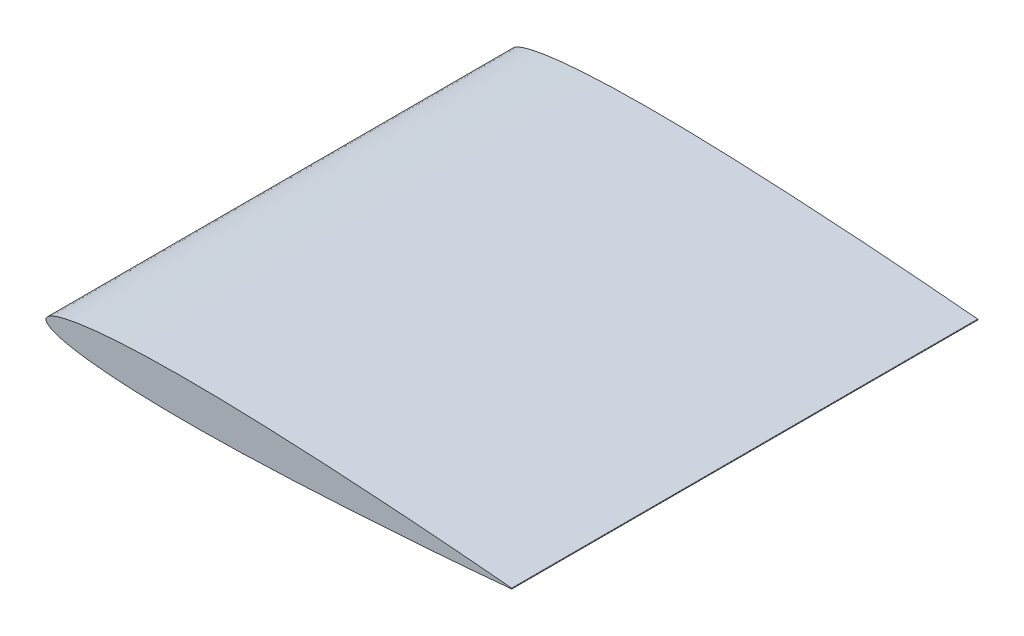
ISO-10303-21;
HEADER;
FILE_DESCRIPTION(('STEP AP214'),'2;1');
FILE_NAME('part.step','',(''),(''),'','','');
FILE_SCHEMA(('AUTOMOTIVE_DESIGN { 1 0 10303 214 1 1 1 1 }'));
ENDSEC;
DATA;
#1=APPLICATION_CONTEXT('core data for automotive mechanical design processes');
#2=APPLICATION_PROTOCOL_DEFINITION('international standard','automotive_design',2000,#1);
#3=PRODUCT_CONTEXT('',#1,'mechanical');
#4=PRODUCT('Part','Part','',(#3));
#5=PRODUCT_RELATED_PRODUCT_CATEGORY('part','',(#4));
#6=PRODUCT_DEFINITION_FORMATION('','',#4);
#7=PRODUCT_DEFINITION_CONTEXT('part definition',#1,'design');
#8=PRODUCT_DEFINITION('design','',#6,#7);
#9=PRODUCT_DEFINITION_SHAPE('','',#8);
#10=(LENGTH_UNIT() NAMED_UNIT(*) SI_UNIT(.MILLI.,.METRE.));
#11=(NAMED_UNIT(*) PLANE_ANGLE_UNIT() SI_UNIT($,.RADIAN.));
#12=(NAMED_UNIT(*) SI_UNIT($,.STERADIAN.) SOLID_ANGLE_UNIT());
#13=UNCERTAINTY_MEASURE_WITH_UNIT(LENGTH_MEASURE(1.E-05),#10,'distance_accuracy_value','');
#14=(GEOMETRIC_REPRESENTATION_CONTEXT(3) GLOBAL_UNCERTAINTY_ASSIGNED_CONTEXT((#13)) GLOBAL_UNIT_ASSIGNED_CONTEXT((#10,
#11,#12)) REPRESENTATION_CONTEXT('',''));
#15=CARTESIAN_POINT('',(0.,0.,0.));
#16=DIRECTION('',(0.,0.,1.));
#17=DIRECTION('',(1.,0.,0.));
#18=AXIS2_PLACEMENT_3D('',#15,#16,#17);
#19=CARTESIAN_POINT('',(142.729373899223,0.159972039207736,-190.5));
#20=CARTESIAN_POINT('',(142.479186781948,0.183389240949801,-190.5));
#21=CARTESIAN_POINT('',(142.088604252542,0.220145092693944,-190.5));
#22=CARTESIAN_POINT('',(141.526697730812,0.272742751406665,-190.5));
#23=CARTESIAN_POINT('',(141.012814783548,0.320538816976024,-190.5));
#24=CARTESIAN_POINT('',(140.406748418489,0.376789486376101,-190.5));
#25=CARTESIAN_POINT('',(139.708986664848,0.441220047436592,-190.5));
#26=CARTESIAN_POINT('',(138.920333107288,0.51403566806961,-190.5));
#27=CARTESIAN_POINT('',(138.041417356676,0.59430420814471,-190.5));
#28=CARTESIAN_POINT('',(137.073229569794,0.682249039644804,-190.5));
#29=CARTESIAN_POINT('',(136.016765435286,0.778107959823981,-190.5));
#30=CARTESIAN_POINT('',(134.872993078166,0.880464916645677,-190.5));
#31=CARTESIAN_POINT('',(133.643037517829,0.990222815984241,-190.5));
#32=CARTESIAN_POINT('',(132.328108140328,1.10652887809074,-190.5));
#33=CARTESIAN_POINT('',(130.929495464496,1.22924505829896,-190.5));
#34=CARTESIAN_POINT('',(129.448626559515,1.35774600885281,-190.5));
#35=CARTESIAN_POINT('',(127.886955115269,1.49238130431334,-190.5));
#36=CARTESIAN_POINT('',(126.245957209597,1.63229773767781,-190.5));
#37=CARTESIAN_POINT('',(124.527338311727,1.777077732539,-190.5));
#38=CARTESIAN_POINT('',(122.732803785357,1.92706831396486,-190.5));
#39=CARTESIAN_POINT('',(120.864080122935,2.08135886131517,-190.5));
#40=CARTESIAN_POINT('',(118.922876779055,2.23957548704205,-190.5));
#41=CARTESIAN_POINT('',(116.911283181738,2.40206902055985,-190.5));
#42=CARTESIAN_POINT('',(114.831256695494,2.56761967202432,-190.5));
#43=CARTESIAN_POINT('',(112.684865067471,2.73630458443066,-190.5));
#44=CARTESIAN_POINT('',(110.474213261044,2.90795710696232,-190.5));
#45=CARTESIAN_POINT('',(108.201422873191,3.08179772831832,-190.5));
#46=CARTESIAN_POINT('',(105.868808461494,3.25783808934433,-190.5));
#47=CARTESIAN_POINT('',(103.478652206742,3.43568118888438,-190.5));
#48=CARTESIAN_POINT('',(101.03320096793,3.61449735595793,-190.5));
#49=CARTESIAN_POINT('',(98.5350487790652,3.79467067884001,-190.5));
#50=CARTESIAN_POINT('',(95.9865707596696,3.97539591531313,-190.5));
#51=CARTESIAN_POINT('',(93.390301344807,4.15622894625216,-190.5));
#52=CARTESIAN_POINT('',(90.7488183868106,4.33730963289552,-190.5));
#53=CARTESIAN_POINT('',(88.0646603918126,4.51739744301513,-190.5));
#54=CARTESIAN_POINT('',(85.3405433275165,4.69685772906639,-190.5));
#55=CARTESIAN_POINT('',(82.5791313789845,4.87532487952883,-190.5));
#56=CARTESIAN_POINT('',(79.7831039473282,5.05164489269945,-190.5));
#57=CARTESIAN_POINT('',(76.9553746181777,5.22629329256366,-190.5));
#58=CARTESIAN_POINT('',(74.0985726217929,5.39838804570514,-190.5));
#59=CARTESIAN_POINT('',(71.2156347958231,5.56772229979622,-190.5));
#60=CARTESIAN_POINT('',(67.327609501056,5.78951399249321,-190.5));
#61=CARTESIAN_POINT('',(63.4141127462938,6.00344160630866,-190.5));
#62=CARTESIAN_POINT('',(59.4788095479756,6.20716181235994,-190.5));
#63=CARTESIAN_POINT('',(56.5079267497801,6.35594717328671,-190.5));
#64=CARTESIAN_POINT('',(53.5281299816943,6.49874071209984,-190.5));
#65=CARTESIAN_POINT('',(50.5425001002317,6.63572882319038,-190.5));
#66=CARTESIAN_POINT('',(47.5539579826413,6.76656668096271,-190.5));
#67=CARTESIAN_POINT('',(44.5653954103751,6.8901812602542,-190.5));
#68=CARTESIAN_POINT('',(41.5797529213656,7.00662209650516,-190.5));
#69=CARTESIAN_POINT('',(38.5999524872136,7.11559771700663,-190.5));
#70=CARTESIAN_POINT('',(35.629015167185,7.21596220002168,-190.5));
#71=CARTESIAN_POINT('',(32.6698225020347,7.30798873354714,-190.5));
#72=CARTESIAN_POINT('',(29.7253345911511,7.39064405803896,-190.5));
#73=CARTESIAN_POINT('',(26.7984290956475,7.4642709780063,-190.5));
#74=CARTESIAN_POINT('',(23.89199813339,7.52744887224202,-190.5));
#75=CARTESIAN_POINT('',(21.0089867489146,7.58092916447286,-190.5));
#76=CARTESIAN_POINT('',(18.1520983205952,7.62309952248371,-190.5));
#77=CARTESIAN_POINT('',(15.3242747238992,7.65512365878461,-190.5));
#78=CARTESIAN_POINT('',(12.5281604710234,7.67505609045825,-190.5));
#79=CARTESIAN_POINT('',(8.87161059142888,7.68668397747053,-190.5));
#80=CARTESIAN_POINT('',(5.26645716396965,7.67500178124356,-190.5));
#81=CARTESIAN_POINT('',(1.71647728043693,7.63773437312726,-190.5));
#82=CARTESIAN_POINT('',(-0.879931687152119,7.5977224832543,-190.5));
#83=CARTESIAN_POINT('',(-3.42856687517991,7.54500625909924,-190.5));
#84=CARTESIAN_POINT('',(-5.92690515442437,7.47994901789238,-190.5));
#85=CARTESIAN_POINT('',(-8.37250727798143,7.40159613562972,-190.5));
#86=CARTESIAN_POINT('',(-10.7628758947234,7.31103769545079,-190.5));
#87=CARTESIAN_POINT('',(-13.0956818614298,7.20719080406453,-190.5));
#88=CARTESIAN_POINT('',(-15.3686793703177,7.09098458850275,-190.5));
#89=CARTESIAN_POINT('',(-17.5795616174868,6.96209558882579,-190.5));
#90=CARTESIAN_POINT('',(-19.7261912714641,6.82091543903912,-190.5));
#91=CARTESIAN_POINT('',(-22.4547036092264,6.61933549797191,-190.5));
#92=CARTESIAN_POINT('',(-25.0900728135269,6.39190161429265,-190.5));
#93=CARTESIAN_POINT('',(-27.6288333077701,6.13525548050567,-190.5));
#94=CARTESIAN_POINT('',(-29.4236580361487,5.93456421434373,-190.5));
#95=CARTESIAN_POINT('',(-31.142649200105,5.72367170245318,-190.5));
#96=CARTESIAN_POINT('',(-32.7839781979879,5.50153427356191,-190.5));
#97=CARTESIAN_POINT('',(-34.3460867609795,5.26957130651408,-190.5));
#98=CARTESIAN_POINT('',(-35.8273766898622,5.02761266766267,-190.5));
#99=CARTESIAN_POINT('',(-37.2264867327781,4.77617947567997,-190.5));
#100=CARTESIAN_POINT('',(-38.5419896364056,4.51573291467262,-190.5));
#101=CARTESIAN_POINT('',(-39.7725614246254,4.24639761172972,-190.5));
#102=CARTESIAN_POINT('',(-40.9170432185424,3.96904878024634,-190.5));
#103=CARTESIAN_POINT('',(-41.9744916712147,3.68406692694299,-190.5));
#104=CARTESIAN_POINT('',(-42.9436793406703,3.39117297901638,-190.5));
#105=CARTESIAN_POINT('',(-43.8238992675171,3.09142558251948,-190.5));
#106=CARTESIAN_POINT('',(-44.6143942574069,2.78529998806159,-190.5));
#107=CARTESIAN_POINT('',(-45.3142323423283,2.47223321008862,-190.5));
#108=CARTESIAN_POINT('',(-45.9233880389311,2.15353035855159,-190.5));
#109=CARTESIAN_POINT('',(-46.4412037339516,1.82845244847433,-190.5));
#110=CARTESIAN_POINT('',(-46.8677473550329,1.49734725273331,-190.5));
#111=CARTESIAN_POINT('',(-47.2031190951666,1.15947564984085,-190.5));
#112=CARTESIAN_POINT('',(-47.4460182134727,0.813039564460823,-190.5));
#113=CARTESIAN_POINT('',(-47.5947412136322,0.456996953228334,-190.5));
#114=CARTESIAN_POINT('',(-47.6445302270355,0.09371251662579,-190.5));
#115=CARTESIAN_POINT('',(-47.5950986214587,-0.269620724495049,-190.5));
#116=CARTESIAN_POINT('',(-47.4467259527999,-0.625809470786623,-190.5));
#117=CARTESIAN_POINT('',(-47.2041677610749,-0.972484342322491,-190.5));
#118=CARTESIAN_POINT('',(-46.8691285668963,-1.31068570613632,-190.5));
#119=CARTESIAN_POINT('',(-46.4429108793843,-1.64221035708078,-190.5));
#120=CARTESIAN_POINT('',(-45.9254152327122,-1.96779751485143,-190.5));
#121=CARTESIAN_POINT('',(-45.3165733571456,-2.28709947356454,-190.5));
#122=CARTESIAN_POINT('',(-44.6170435926118,-2.6008545709066,-190.5));
#123=CARTESIAN_POINT('',(-43.8268501385373,-2.90775767248889,-190.5));
#124=CARTESIAN_POINT('',(-42.9469255163235,-3.2083708467626,-190.5));
#125=CARTESIAN_POINT('',(-41.9780264524212,-3.50221809845285,-190.5));
#126=CARTESIAN_POINT('',(-40.9208588644293,-3.78824008654256,-190.5));
#127=CARTESIAN_POINT('',(-39.776650468266,-4.06671467619483,-190.5));
#128=CARTESIAN_POINT('',(-38.5463442360903,-4.33726043284882,-190.5));
#129=CARTESIAN_POINT('',(-37.231098185239,-4.59900100347733,-190.5));
#130=CARTESIAN_POINT('',(-35.8322361685879,-4.85181045858032,-190.5));
#131=CARTESIAN_POINT('',(-34.3511849850747,-5.09522621020338,-190.5));
#132=CARTESIAN_POINT('',(-32.7893053732441,-5.32872580078488,-190.5));
#133=CARTESIAN_POINT('',(-31.1481956989111,-5.55247779164925,-190.5));
#134=CARTESIAN_POINT('',(-29.4294128338146,-5.76506127168081,-190.5));
#135=CARTESIAN_POINT('',(-27.6347864054406,-5.96751811274626,-190.5));
#136=CARTESIAN_POINT('',(-25.0962796171966,-6.22666164663733,-190.5));
#137=CARTESIAN_POINT('',(-22.4611354278776,-6.45668798408461,-190.5));
#138=CARTESIAN_POINT('',(-19.7328227161619,-6.66095202167232,-190.5));
#139=CARTESIAN_POINT('',(-17.5863329879257,-6.80424386584013,-190.5));
#140=CARTESIAN_POINT('',(-15.3755786060796,-6.93530777480651,-190.5));
#141=CARTESIAN_POINT('',(-13.1026965157896,-7.05375001213992,-190.5));
#142=CARTESIAN_POINT('',(-10.7699938380457,-7.15989176828827,-190.5));
#143=CARTESIAN_POINT('',(-8.37971546550868,-7.25280170733938,-190.5));
#144=CARTESIAN_POINT('',(-5.93419160557629,-7.33356043074859,-190.5));
#145=CARTESIAN_POINT('',(-3.43591853579026,-7.40107539911632,-190.5));
#146=CARTESIAN_POINT('',(-0.887336440992833,-7.45629883635755,-190.5));
#147=CARTESIAN_POINT('',(1.70903190823079,-7.4988649432709,-190.5));
#148=CARTESIAN_POINT('',(5.25897341187932,-7.53962465215151,-190.5));
#149=CARTESIAN_POINT('',(8.86411360239678,-7.55485343890251,-190.5));
#150=CARTESIAN_POINT('',(12.5206731516449,-7.54682271533122,-190.5));
#151=CARTESIAN_POINT('',(15.3168056601869,-7.52964099124633,-190.5));
#152=CARTESIAN_POINT('',(18.1446593925085,-7.50039876268522,-190.5));
#153=CARTESIAN_POINT('',(21.0015879238095,-7.46103891006551,-190.5));
#154=CARTESIAN_POINT('',(23.8846505248568,-7.41039482734864,-190.5));
#155=CARTESIAN_POINT('',(26.791142232441,-7.3500761865012,-190.5));
#156=CARTESIAN_POINT('',(29.7181187426697,-7.27932866695085,-190.5));
#157=CARTESIAN_POINT('',(32.6626865415297,-7.19957004407513,-190.5));
#158=CARTESIAN_POINT('',(35.6219683065367,-7.11045468261043,-190.5));
#159=CARTESIAN_POINT('',(38.593002923258,-7.01301292958135,-190.5));
#160=CARTESIAN_POINT('',(41.5729091210837,-6.90696876238633,-190.5));
#161=CARTESIAN_POINT('',(44.5586647149009,-6.79346513021857,-190.5));
#162=CARTESIAN_POINT('',(47.5473474477841,-6.67279063113492,-190.5));
#163=CARTESIAN_POINT('',(50.5360168319547,-6.54489283694325,-190.5));
#164=CARTESIAN_POINT('',(53.5217800317638,-6.41084192747576,-190.5));
#165=CARTESIAN_POINT('',(56.5017158321506,-6.27097985472669,-190.5));
#166=CARTESIAN_POINT('',(59.4727435614599,-6.12511719357998,-190.5));
#167=CARTESIAN_POINT('',(63.4082452667762,-5.92526846954686,-190.5));
#168=CARTESIAN_POINT('',(67.3219505807011,-5.71519089043973,-190.5));
#169=CARTESIAN_POINT('',(71.2101921833016,-5.49722417852046,-190.5));
#170=CARTESIAN_POINT('',(74.0932951980653,-5.33072611764013,-190.5));
#171=CARTESIAN_POINT('',(76.9502651115519,-5.16144184773078,-190.5));
#172=CARTESIAN_POINT('',(79.7781648840411,-4.98957533188432,-190.5));
#173=CARTESIAN_POINT('',(82.574364418838,-4.81600601656573,-190.5));
#174=CARTESIAN_POINT('',(85.3359505995228,-4.64025551175838,-190.5));
#175=CARTESIAN_POINT('',(88.0602428910229,-4.46347518272635,-190.5));
#176=CARTESIAN_POINT('',(90.7445767498917,-4.28602801990158,-190.5));
#177=CARTESIAN_POINT('',(93.3862365691589,-4.10754599915223,-190.5));
#178=CARTESIAN_POINT('',(95.9826826235374,-3.92926715483207,-190.5));
#179=CARTESIAN_POINT('',(98.5313371995309,-3.75104908978917,-190.5));
#180=CARTESIAN_POINT('',(101.029665426397,-3.57333342966464,-190.5));
#181=CARTESIAN_POINT('',(103.475291393599,-3.39692307974503,-190.5));
#182=CARTESIAN_POINT('',(105.865621446236,-3.22143140004116,-190.5));
#183=CARTESIAN_POINT('',(108.198407910205,-3.04768585076806,-190.5));
#184=CARTESIAN_POINT('',(110.471368215268,-2.87608118777745,-190.5));
#185=CARTESIAN_POINT('',(112.682187816413,-2.70660349326627,-190.5));
#186=CARTESIAN_POINT('',(114.828744350842,-2.54003019102171,-190.5));
#187=CARTESIAN_POINT('',(116.908932692255,-2.37652586100645,-190.5));
#188=CARTESIAN_POINT('',(118.92068517039,-2.21601132610121,-190.5));
#189=CARTESIAN_POINT('',(120.86204322171,-2.05970444998824,-190.5));
#190=CARTESIAN_POINT('',(122.730917764336,-1.90725234793281,-190.5));
#191=CARTESIAN_POINT('',(124.525598976688,-1.75902722561333,-190.5));
#192=CARTESIAN_POINT('',(126.24435947132,-1.61593800477977,-190.5));
#193=CARTESIAN_POINT('',(127.88549422675,-1.47763598286804,-190.5));
#194=CARTESIAN_POINT('',(129.447297363781,-1.34453705831539,-190.5));
#195=CARTESIAN_POINT('',(130.92829196594,-1.21749298560932,-190.5));
#196=CARTESIAN_POINT('',(132.327024687941,-1.09615276027977,-190.5));
#197=CARTESIAN_POINT('',(133.642067846106,-0.98114032589048,-190.5));
#198=CARTESIAN_POINT('',(134.87213078642,-0.872592457483473,-190.5));
#199=CARTESIAN_POINT('',(136.01600328449,-0.771360744652599,-190.5));
#200=CARTESIAN_POINT('',(137.072561209703,-0.676541175214349,-190.5));
#201=CARTESIAN_POINT('',(138.040835044463,-0.589548848119938,-190.5));
#202=CARTESIAN_POINT('',(138.919829334544,-0.51014498671436,-190.5));
#203=CARTESIAN_POINT('',(139.708554143384,-0.438105245048746,-190.5));
#204=CARTESIAN_POINT('',(140.406378943424,-0.374361143418198,-190.5));
#205=CARTESIAN_POINT('',(141.012500352223,-0.318706723477558,-190.5));
#206=CARTESIAN_POINT('',(141.714019077583,-0.254154753570296,-190.5));
#207=CARTESIAN_POINT('',(142.275954492989,-0.201866144981758,-190.5));
#208=CARTESIAN_POINT('',(142.666585451411,-0.16562875003313,-190.5));
#209=CARTESIAN_POINT('',(142.729216596021,-0.159828701050094,-190.5));
#210=B_SPLINE_CURVE_WITH_KNOTS('',3,(#19,#20,#21,#22,#23,#24,#25,#26,#27,#28,#29,#30,#31,#32,
#33,#34,#35,#36,#37,#38,#39,#40,#41,#42,#43,#44,#45,#46,#47,#48,#49,#50,#51,#52,#53,#54,#55,#56,
#57,#58,#59,#60,#61,#62,#63,#64,#65,#66,#67,#68,#69,#70,#71,#72,#73,#74,#75,#76,#77,#78,#79,#80,
#81,#82,#83,#84,#85,#86,#87,#88,#89,#90,#91,#92,#93,#94,#95,#96,#97,#98,#99,#100,#101,#102,#103,
#104,#105,#106,#107,#108,#109,#110,#111,#112,#113,#114,#115,#116,#117,#118,#119,#120,#121,#122,
#123,#124,#125,#126,#127,#128,#129,#130,#131,#132,#133,#134,#135,#136,#137,#138,#139,#140,#141,
#142,#143,#144,#145,#146,#147,#148,#149,#150,#151,#152,#153,#154,#155,#156,#157,#158,#159,#160,
#161,#162,#163,#164,#165,#166,#167,#168,#169,#170,#171,#172,#173,#174,#175,#176,#177,#178,#179,
#180,#181,#182,#183,#184,#185,#186,#187,#188,#189,#190,#191,#192,#193,#194,#195,#196,#197,#198,
#199,#200,#201,#202,#203,#204,#205,#206,#207,#208,#209),.UNSPECIFIED.,.F.,.F.,(4,1,1,1,1,1,1,1,
1,1,1,1,1,1,1,1,1,1,1,1,1,1,1,1,1,1,1,1,1,1,1,1,1,1,1,1,1,1,1,1,1,1,1,1,1,1,1,1,1,1,1,1,1,1,1,1,
1,1,1,1,1,1,1,1,1,1,1,1,1,1,1,1,1,1,1,1,1,1,1,1,1,1,1,1,1,1,1,1,1,1,1,1,1,1,1,1,1,1,1,1,1,1,1,1,
1,1,1,1,1,1,1,1,1,1,1,1,1,1,1,1,1,1,1,1,1,1,1,1,1,1,1,1,1,1,1,1,1,1,1,1,1,1,1,1,1,1,1,1,1,1,1,1,
1,1,1,1,1,1,1,1,1,1,1,1,1,1,1,1,1,1,1,1,1,1,1,1,1,1,1,1,1,1,1,1,1,1,1,1,4),(0.,
0.00196048808038713,0.00306078288954723,0.00440315115940912,0.00598710015129242,
0.00780962678363534,0.00987023823900945,0.0121663346757214,0.0146954518877861,
0.0174551251234933,0.02044271277755,0.0236548086080142,0.0270893538626305,0.0307418252005211,
0.0346086867033355,0.0386864881218547,0.0429711593175618,0.0474581806910442,0.0521426222949407,
0.0570209113106773,0.0620875440252226,0.0673380838166943,0.0727664556702497,0.0783671978029203,
0.0841358352788509,0.0900658434760326,0.0961512680582257,0.102386611537683,0.108765354390163,
0.115281579792531,0.121927783097088,0.128698472150078,0.135586708286801,0.142584959552117,
0.149687310329046,0.156886297525978,0.164174397596375,0.171545202082814,0.178990235007278,
0.186503524082293,0.19407660018027,0.209373856557355,0.217082104500233,0.224820878258927,
0.232581678728304,0.240357097895689,0.248139212500892,0.255920557432258,0.263693736348385,
0.271450841908107,0.279184433986156,0.286886142530036,0.294549552175486,0.302166304681413,
0.309729003720638,0.317230802900191,0.324663342863254,0.33202078832295,0.339294805126573,
0.346479079665125,0.360549206686105,0.367421988824451,0.374177392410363,0.380808670431015,
0.387310567301367,0.39367589404474,0.399898904621057,0.405973448559045,0.411894304865592,
0.417655822568995,0.423251855178719,0.428678293697983,0.439001415070994,0.443888497126718,
0.448586274186794,0.453091621508016,0.457400294036188,0.461508300583175,0.465412430347771,
0.469110006265822,0.472598492016245,0.475874566730092,0.478937452099033,0.481785324488124,
0.484418023324207,0.486835407607488,0.489038388494032,0.491029428368055,0.492813910030444,
0.494397940793629,0.49579342619979,0.497018051790781,0.498098706349558,0.499074547748848,0.5,
0.500925452251153,0.501901293650443,0.50298194820922,0.504206573800211,0.505602059206371,
0.507186089969557,0.508970571631945,0.510961611505969,0.513164592392513,0.515581976675793,
0.518214675511877,0.521062547900968,0.524125433269908,0.527401507983756,0.530889993734179,
0.534587569652229,0.538491699416826,0.542599705963813,0.546908378491985,0.551413725813207,
0.556111502873283,0.560998584929006,0.571321706302018,0.576748144821282,0.582344177431006,
0.588105695134409,0.594026551440956,0.600101095378944,0.606324105955261,0.612689432698634,
0.619191329568986,0.625822607589638,0.63257801117555,0.639450793313896,0.653520920334876,
0.660705194873427,0.66797921167705,0.675336657136746,0.68276919709981,0.690270996279362,
0.697833695318588,0.705450447824515,0.713113857469964,0.720815566013845,0.728549158091893,
0.736306263651616,0.744079442567742,0.751860787499109,0.759642902104311,0.767418321271696,
0.775179121741073,0.782917895499768,0.790626143442646,0.80592339981973,0.813496475917707,
0.821009764992723,0.828454797917186,0.835825602403626,0.843113702474022,0.850312689670955,
0.857415040447883,0.864413291713199,0.871301527849922,0.878072216902913,0.884718420207469,
0.891234645609837,0.897613388462318,0.903848731941775,0.909934156523968,0.91586416472115,
0.92163280219708,0.927233544329751,0.932661916183306,0.937912455974778,0.942979088689323,
0.94785737770506,0.952541819308956,0.957028840682438,0.961313511878146,0.965391313296665,
0.969258174799479,0.97291064613737,0.976345191391986,0.97955728722245,0.982544874876507,
0.985304548112214,0.987833665324279,0.990129761760991,0.992190373216365,0.994012899848708,
0.995596848840591,0.996939217110453,0.999509261835069,1.),.UNSPECIFIED.);
#211=DIRECTION('',(0.,0.,1.));
#212=VECTOR('',#211,1.);
#213=SURFACE_OF_LINEAR_EXTRUSION('',#210,#212);
#214=CARTESIAN_POINT('',(142.729373899223,0.159972039207736,0.));
#215=CARTESIAN_POINT('',(142.479186781948,0.183389240949801,0.));
#216=CARTESIAN_POINT('',(142.088604252542,0.220145092693944,0.));
#217=CARTESIAN_POINT('',(141.526697730812,0.272742751406665,0.));
#218=CARTESIAN_POINT('',(141.012814783548,0.320538816976024,0.));
#219=CARTESIAN_POINT('',(140.406748418489,0.376789486376101,0.));
#220=CARTESIAN_POINT('',(139.708986664848,0.441220047436592,0.));
#221=CARTESIAN_POINT('',(138.920333107288,0.51403566806961,0.));
#222=CARTESIAN_POINT('',(138.041417356676,0.59430420814471,0.));
#223=CARTESIAN_POINT('',(137.073229569794,0.682249039644804,0.));
#224=CARTESIAN_POINT('',(136.016765435286,0.778107959823981,0.));
#225=CARTESIAN_POINT('',(134.872993078166,0.880464916645677,0.));
#226=CARTESIAN_POINT('',(133.643037517829,0.990222815984241,0.));
#227=CARTESIAN_POINT('',(132.328108140328,1.10652887809074,0.));
#228=CARTESIAN_POINT('',(130.929495464496,1.22924505829896,0.));
#229=CARTESIAN_POINT('',(129.448626559515,1.35774600885281,0.));
#230=CARTESIAN_POINT('',(127.886955115269,1.49238130431334,0.));
#231=CARTESIAN_POINT('',(126.245957209597,1.63229773767781,0.));
#232=CARTESIAN_POINT('',(124.527338311727,1.777077732539,0.));
#233=CARTESIAN_POINT('',(122.732803785357,1.92706831396486,0.));
#234=CARTESIAN_POINT('',(120.864080122935,2.08135886131517,0.));
#235=CARTESIAN_POINT('',(118.922876779055,2.23957548704205,0.));
#236=CARTESIAN_POINT('',(116.911283181738,2.40206902055985,0.));
#237=CARTESIAN_POINT('',(114.831256695494,2.56761967202432,0.));
#238=CARTESIAN_POINT('',(112.684865067471,2.73630458443066,0.));
#239=CARTESIAN_POINT('',(110.474213261044,2.90795710696232,0.));
#240=CARTESIAN_POINT('',(108.201422873191,3.08179772831832,0.));
#241=CARTESIAN_POINT('',(105.868808461494,3.25783808934433,0.));
#242=CARTESIAN_POINT('',(103.478652206742,3.43568118888438,0.));
#243=CARTESIAN_POINT('',(101.03320096793,3.61449735595793,0.));
#244=CARTESIAN_POINT('',(98.5350487790652,3.79467067884001,0.));
#245=CARTESIAN_POINT('',(95.9865707596696,3.97539591531313,0.));
#246=CARTESIAN_POINT('',(93.390301344807,4.15622894625216,0.));
#247=CARTESIAN_POINT('',(90.7488183868106,4.33730963289552,0.));
#248=CARTESIAN_POINT('',(88.0646603918126,4.51739744301513,0.));
#249=CARTESIAN_POINT('',(85.3405433275165,4.69685772906639,0.));
#250=CARTESIAN_POINT('',(82.5791313789845,4.87532487952883,0.));
#251=CARTESIAN_POINT('',(79.7831039473282,5.05164489269945,0.));
#252=CARTESIAN_POINT('',(76.9553746181777,5.22629329256366,0.));
#253=CARTESIAN_POINT('',(74.0985726217929,5.39838804570514,0.));
#254=CARTESIAN_POINT('',(71.2156347958231,5.56772229979622,0.));
#255=CARTESIAN_POINT('',(67.327609501056,5.78951399249321,0.));
#256=CARTESIAN_POINT('',(63.4141127462938,6.00344160630866,0.));
#257=CARTESIAN_POINT('',(59.4788095479756,6.20716181235994,0.));
#258=CARTESIAN_POINT('',(56.5079267497801,6.35594717328671,0.));
#259=CARTESIAN_POINT('',(53.5281299816943,6.49874071209984,0.));
#260=CARTESIAN_POINT('',(50.5425001002317,6.63572882319038,0.));
#261=CARTESIAN_POINT('',(47.5539579826413,6.76656668096271,0.));
#262=CARTESIAN_POINT('',(44.5653954103751,6.8901812602542,0.));
#263=CARTESIAN_POINT('',(41.5797529213656,7.00662209650516,0.));
#264=CARTESIAN_POINT('',(38.5999524872136,7.11559771700663,0.));
#265=CARTESIAN_POINT('',(35.629015167185,7.21596220002168,0.));
#266=CARTESIAN_POINT('',(32.6698225020347,7.30798873354714,0.));
#267=CARTESIAN_POINT('',(29.7253345911511,7.39064405803896,0.));
#268=CARTESIAN_POINT('',(26.7984290956475,7.4642709780063,0.));
#269=CARTESIAN_POINT('',(23.89199813339,7.52744887224202,0.));
#270=CARTESIAN_POINT('',(21.0089867489146,7.58092916447286,0.));
#271=CARTESIAN_POINT('',(18.1520983205952,7.62309952248371,0.));
#272=CARTESIAN_POINT('',(15.3242747238992,7.65512365878461,0.));
#273=CARTESIAN_POINT('',(12.5281604710234,7.67505609045825,0.));
#274=CARTESIAN_POINT('',(8.87161059142888,7.68668397747053,0.));
#275=CARTESIAN_POINT('',(5.26645716396965,7.67500178124356,0.));
#276=CARTESIAN_POINT('',(1.71647728043693,7.63773437312726,0.));
#277=CARTESIAN_POINT('',(-0.879931687152119,7.5977224832543,0.));
#278=CARTESIAN_POINT('',(-3.42856687517991,7.54500625909924,0.));
#279=CARTESIAN_POINT('',(-5.92690515442437,7.47994901789238,0.));
#280=CARTESIAN_POINT('',(-8.37250727798143,7.40159613562972,0.));
#281=CARTESIAN_POINT('',(-10.7628758947234,7.31103769545079,0.));
#282=CARTESIAN_POINT('',(-13.0956818614298,7.20719080406453,0.));
#283=CARTESIAN_POINT('',(-15.3686793703177,7.09098458850275,0.));
#284=CARTESIAN_POINT('',(-17.5795616174868,6.96209558882579,0.));
#285=CARTESIAN_POINT('',(-19.7261912714641,6.82091543903912,0.));
#286=CARTESIAN_POINT('',(-22.4547036092264,6.61933549797191,0.));
#287=CARTESIAN_POINT('',(-25.0900728135269,6.39190161429265,0.));
#288=CARTESIAN_POINT('',(-27.6288333077701,6.13525548050567,0.));
#289=CARTESIAN_POINT('',(-29.4236580361487,5.93456421434373,0.));
#290=CARTESIAN_POINT('',(-31.142649200105,5.72367170245318,0.));
#291=CARTESIAN_POINT('',(-32.7839781979879,5.50153427356191,0.));
#292=CARTESIAN_POINT('',(-34.3460867609795,5.26957130651408,0.));
#293=CARTESIAN_POINT('',(-35.8273766898622,5.02761266766267,0.));
#294=CARTESIAN_POINT('',(-37.2264867327781,4.77617947567997,0.));
#295=CARTESIAN_POINT('',(-38.5419896364056,4.51573291467262,0.));
#296=CARTESIAN_POINT('',(-39.7725614246254,4.24639761172972,0.));
#297=CARTESIAN_POINT('',(-40.9170432185424,3.96904878024634,0.));
#298=CARTESIAN_POINT('',(-41.9744916712147,3.68406692694299,0.));
#299=CARTESIAN_POINT('',(-42.9436793406703,3.39117297901638,0.));
#300=CARTESIAN_POINT('',(-43.8238992675171,3.09142558251948,0.));
#301=CARTESIAN_POINT('',(-44.6143942574069,2.78529998806159,0.));
#302=CARTESIAN_POINT('',(-45.3142323423283,2.47223321008862,0.));
#303=CARTESIAN_POINT('',(-45.9233880389311,2.15353035855159,0.));
#304=CARTESIAN_POINT('',(-46.4412037339516,1.82845244847433,0.));
#305=CARTESIAN_POINT('',(-46.8677473550329,1.49734725273331,0.));
#306=CARTESIAN_POINT('',(-47.2031190951666,1.15947564984085,0.));
#307=CARTESIAN_POINT('',(-47.4460182134727,0.813039564460823,0.));
#308=CARTESIAN_POINT('',(-47.5947412136322,0.456996953228334,0.));
#309=CARTESIAN_POINT('',(-47.6445302270355,0.09371251662579,0.));
#310=CARTESIAN_POINT('',(-47.5950986214587,-0.269620724495049,0.));
#311=CARTESIAN_POINT('',(-47.4467259527999,-0.625809470786623,0.));
#312=CARTESIAN_POINT('',(-47.2041677610749,-0.972484342322491,0.));
#313=CARTESIAN_POINT('',(-46.8691285668963,-1.31068570613632,0.));
#314=CARTESIAN_POINT('',(-46.4429108793843,-1.64221035708078,0.));
#315=CARTESIAN_POINT('',(-45.9254152327122,-1.96779751485143,0.));
#316=CARTESIAN_POINT('',(-45.3165733571456,-2.28709947356454,0.));
#317=CARTESIAN_POINT('',(-44.6170435926118,-2.6008545709066,0.));
#318=CARTESIAN_POINT('',(-43.8268501385373,-2.90775767248889,0.));
#319=CARTESIAN_POINT('',(-42.9469255163235,-3.2083708467626,0.));
#320=CARTESIAN_POINT('',(-41.9780264524212,-3.50221809845285,0.));
#321=CARTESIAN_POINT('',(-40.9208588644293,-3.78824008654256,0.));
#322=CARTESIAN_POINT('',(-39.776650468266,-4.06671467619483,0.));
#323=CARTESIAN_POINT('',(-38.5463442360903,-4.33726043284882,0.));
#324=CARTESIAN_POINT('',(-37.231098185239,-4.59900100347733,0.));
#325=CARTESIAN_POINT('',(-35.8322361685879,-4.85181045858032,0.));
#326=CARTESIAN_POINT('',(-34.3511849850747,-5.09522621020338,0.));
#327=CARTESIAN_POINT('',(-32.7893053732441,-5.32872580078488,0.));
#328=CARTESIAN_POINT('',(-31.1481956989111,-5.55247779164925,0.));
#329=CARTESIAN_POINT('',(-29.4294128338146,-5.76506127168081,0.));
#330=CARTESIAN_POINT('',(-27.6347864054406,-5.96751811274626,0.));
#331=CARTESIAN_POINT('',(-25.0962796171966,-6.22666164663733,0.));
#332=CARTESIAN_POINT('',(-22.4611354278776,-6.45668798408461,0.));
#333=CARTESIAN_POINT('',(-19.7328227161619,-6.66095202167232,0.));
#334=CARTESIAN_POINT('',(-17.5863329879257,-6.80424386584013,0.));
#335=CARTESIAN_POINT('',(-15.3755786060796,-6.93530777480651,0.));
#336=CARTESIAN_POINT('',(-13.1026965157896,-7.05375001213992,0.));
#337=CARTESIAN_POINT('',(-10.7699938380457,-7.15989176828827,0.));
#338=CARTESIAN_POINT('',(-8.37971546550868,-7.25280170733938,0.));
#339=CARTESIAN_POINT('',(-5.93419160557629,-7.33356043074859,0.));
#340=CARTESIAN_POINT('',(-3.43591853579026,-7.40107539911632,0.));
#341=CARTESIAN_POINT('',(-0.887336440992833,-7.45629883635755,0.));
#342=CARTESIAN_POINT('',(1.70903190823079,-7.4988649432709,0.));
#343=CARTESIAN_POINT('',(5.25897341187932,-7.53962465215151,0.));
#344=CARTESIAN_POINT('',(8.86411360239678,-7.55485343890251,0.));
#345=CARTESIAN_POINT('',(12.5206731516449,-7.54682271533122,0.));
#346=CARTESIAN_POINT('',(15.3168056601869,-7.52964099124633,0.));
#347=CARTESIAN_POINT('',(18.1446593925085,-7.50039876268522,0.));
#348=CARTESIAN_POINT('',(21.0015879238095,-7.46103891006551,0.));
#349=CARTESIAN_POINT('',(23.8846505248568,-7.41039482734864,0.));
#350=CARTESIAN_POINT('',(26.791142232441,-7.3500761865012,0.));
#351=CARTESIAN_POINT('',(29.7181187426697,-7.27932866695085,0.));
#352=CARTESIAN_POINT('',(32.6626865415297,-7.19957004407513,0.));
#353=CARTESIAN_POINT('',(35.6219683065367,-7.11045468261043,0.));
#354=CARTESIAN_POINT('',(38.593002923258,-7.01301292958135,0.));
#355=CARTESIAN_POINT('',(41.5729091210837,-6.90696876238633,0.));
#356=CARTESIAN_POINT('',(44.5586647149009,-6.79346513021857,0.));
#357=CARTESIAN_POINT('',(47.5473474477841,-6.67279063113492,0.));
#358=CARTESIAN_POINT('',(50.5360168319547,-6.54489283694325,0.));
#359=CARTESIAN_POINT('',(53.5217800317638,-6.41084192747576,0.));
#360=CARTESIAN_POINT('',(56.5017158321506,-6.27097985472669,0.));
#361=CARTESIAN_POINT('',(59.4727435614599,-6.12511719357998,0.));
#362=CARTESIAN_POINT('',(63.4082452667762,-5.92526846954686,0.));
#363=CARTESIAN_POINT('',(67.3219505807011,-5.71519089043973,0.));
#364=CARTESIAN_POINT('',(71.2101921833016,-5.49722417852046,0.));
#365=CARTESIAN_POINT('',(74.0932951980653,-5.33072611764013,0.));
#366=CARTESIAN_POINT('',(76.9502651115519,-5.16144184773078,0.));
#367=CARTESIAN_POINT('',(79.7781648840411,-4.98957533188432,0.));
#368=CARTESIAN_POINT('',(82.574364418838,-4.81600601656573,0.));
#369=CARTESIAN_POINT('',(85.3359505995228,-4.64025551175838,0.));
#370=CARTESIAN_POINT('',(88.0602428910229,-4.46347518272635,0.));
#371=CARTESIAN_POINT('',(90.7445767498917,-4.28602801990158,0.));
#372=CARTESIAN_POINT('',(93.3862365691589,-4.10754599915223,0.));
#373=CARTESIAN_POINT('',(95.9826826235374,-3.92926715483207,0.));
#374=CARTESIAN_POINT('',(98.5313371995309,-3.75104908978917,0.));
#375=CARTESIAN_POINT('',(101.029665426397,-3.57333342966464,0.));
#376=CARTESIAN_POINT('',(103.475291393599,-3.39692307974503,0.));
#377=CARTESIAN_POINT('',(105.865621446236,-3.22143140004116,0.));
#378=CARTESIAN_POINT('',(108.198407910205,-3.04768585076806,0.));
#379=CARTESIAN_POINT('',(110.471368215268,-2.87608118777745,0.));
#380=CARTESIAN_POINT('',(112.682187816413,-2.70660349326627,0.));
#381=CARTESIAN_POINT('',(114.828744350842,-2.54003019102171,0.));
#382=CARTESIAN_POINT('',(116.908932692255,-2.37652586100645,0.));
#383=CARTESIAN_POINT('',(118.92068517039,-2.21601132610121,0.));
#384=CARTESIAN_POINT('',(120.86204322171,-2.05970444998824,0.));
#385=CARTESIAN_POINT('',(122.730917764336,-1.90725234793281,0.));
#386=CARTESIAN_POINT('',(124.525598976688,-1.75902722561333,0.));
#387=CARTESIAN_POINT('',(126.24435947132,-1.61593800477977,0.));
#388=CARTESIAN_POINT('',(127.88549422675,-1.47763598286804,0.));
#389=CARTESIAN_POINT('',(129.447297363781,-1.34453705831539,0.));
#390=CARTESIAN_POINT('',(130.92829196594,-1.21749298560932,0.));
#391=CARTESIAN_POINT('',(132.327024687941,-1.09615276027977,0.));
#392=CARTESIAN_POINT('',(133.642067846106,-0.98114032589048,0.));
#393=CARTESIAN_POINT('',(134.87213078642,-0.872592457483473,0.));
#394=CARTESIAN_POINT('',(136.01600328449,-0.771360744652599,0.));
#395=CARTESIAN_POINT('',(137.072561209703,-0.676541175214349,0.));
#396=CARTESIAN_POINT('',(138.040835044463,-0.589548848119938,0.));
#397=CARTESIAN_POINT('',(138.919829334544,-0.51014498671436,0.));
#398=CARTESIAN_POINT('',(139.708554143384,-0.438105245048746,0.));
#399=CARTESIAN_POINT('',(140.406378943424,-0.374361143418198,0.));
#400=CARTESIAN_POINT('',(141.012500352223,-0.318706723477558,0.));
#401=CARTESIAN_POINT('',(141.714019077583,-0.254154753570296,0.));
#402=CARTESIAN_POINT('',(142.275954492989,-0.201866144981758,0.));
#403=CARTESIAN_POINT('',(142.666585451411,-0.16562875003313,0.));
#404=CARTESIAN_POINT('',(142.729216596021,-0.159828701050094,0.));
#405=B_SPLINE_CURVE_WITH_KNOTS('',3,(#214,#215,#216,#217,#218,#219,#220,#221,#222,#223,#224,
#225,#226,#227,#228,#229,#230,#231,#232,#233,#234,#235,#236,#237,#238,#239,#240,#241,#242,#243,
#244,#245,#246,#247,#248,#249,#250,#251,#252,#253,#254,#255,#256,#257,#258,#259,#260,#261,#262,
#263,#264,#265,#266,#267,#268,#269,#270,#271,#272,#273,#274,#275,#276,#277,#278,#279,#280,#281,
#282,#283,#284,#285,#286,#287,#288,#289,#290,#291,#292,#293,#294,#295,#296,#297,#298,#299,#300,
#301,#302,#303,#304,#305,#306,#307,#308,#309,#310,#311,#312,#313,#314,#315,#316,#317,#318,#319,
#320,#321,#322,#323,#324,#325,#326,#327,#328,#329,#330,#331,#332,#333,#334,#335,#336,#337,#338,
#339,#340,#341,#342,#343,#344,#345,#346,#347,#348,#349,#350,#351,#352,#353,#354,#355,#356,#357,
#358,#359,#360,#361,#362,#363,#364,#365,#366,#367,#368,#369,#370,#371,#372,#373,#374,#375,#376,
#377,#378,#379,#380,#381,#382,#383,#384,#385,#386,#387,#388,#389,#390,#391,#392,#393,#394,#395,
#396,#397,#398,#399,#400,#401,#402,#403,#404),.UNSPECIFIED.,.F.,.F.,(4,1,1,1,1,1,1,1,1,1,1,1,1,
1,1,1,1,1,1,1,1,1,1,1,1,1,1,1,1,1,1,1,1,1,1,1,1,1,1,1,1,1,1,1,1,1,1,1,1,1,1,1,1,1,1,1,1,1,1,1,1,
1,1,1,1,1,1,1,1,1,1,1,1,1,1,1,1,1,1,1,1,1,1,1,1,1,1,1,1,1,1,1,1,1,1,1,1,1,1,1,1,1,1,1,1,1,1,1,1,
1,1,1,1,1,1,1,1,1,1,1,1,1,1,1,1,1,1,1,1,1,1,1,1,1,1,1,1,1,1,1,1,1,1,1,1,1,1,1,1,1,1,1,1,1,1,1,1,
1,1,1,1,1,1,1,1,1,1,1,1,1,1,1,1,1,1,1,1,1,1,1,1,1,1,1,1,1,1,1,4),(0.,0.00196048808038713,
0.00306078288954723,0.00440315115940912,0.00598710015129242,0.00780962678363534,
0.00987023823900945,0.0121663346757214,0.0146954518877861,0.0174551251234933,0.02044271277755,
0.0236548086080142,0.0270893538626305,0.0307418252005211,0.0346086867033355,0.0386864881218547,
0.0429711593175618,0.0474581806910442,0.0521426222949407,0.0570209113106773,0.0620875440252226,
0.0673380838166943,0.0727664556702497,0.0783671978029203,0.0841358352788509,0.0900658434760326,
0.0961512680582257,0.102386611537683,0.108765354390163,0.115281579792531,0.121927783097088,
0.128698472150078,0.135586708286801,0.142584959552117,0.149687310329046,0.156886297525978,
0.164174397596375,0.171545202082814,0.178990235007278,0.186503524082293,0.19407660018027,
0.209373856557355,0.217082104500233,0.224820878258927,0.232581678728304,0.240357097895689,
0.248139212500892,0.255920557432258,0.263693736348385,0.271450841908107,0.279184433986156,
0.286886142530036,0.294549552175486,0.302166304681413,0.309729003720638,0.317230802900191,
0.324663342863254,0.33202078832295,0.339294805126573,0.346479079665125,0.360549206686105,
0.367421988824451,0.374177392410363,0.380808670431015,0.387310567301367,0.39367589404474,
0.399898904621057,0.405973448559045,0.411894304865592,0.417655822568995,0.423251855178719,
0.428678293697983,0.439001415070994,0.443888497126718,0.448586274186794,0.453091621508016,
0.457400294036188,0.461508300583175,0.465412430347771,0.469110006265822,0.472598492016245,
0.475874566730092,0.478937452099033,0.481785324488124,0.484418023324207,0.486835407607488,
0.489038388494032,0.491029428368055,0.492813910030444,0.494397940793629,0.49579342619979,
0.497018051790781,0.498098706349558,0.499074547748848,0.5,0.500925452251153,0.501901293650443,
0.50298194820922,0.504206573800211,0.505602059206371,0.507186089969557,0.508970571631945,
0.510961611505969,0.513164592392513,0.515581976675793,0.518214675511877,0.521062547900968,
0.524125433269908,0.527401507983756,0.530889993734179,0.534587569652229,0.538491699416826,
0.542599705963813,0.546908378491985,0.551413725813207,0.556111502873283,0.560998584929006,
0.571321706302018,0.576748144821282,0.582344177431006,0.588105695134409,0.594026551440956,
0.600101095378944,0.606324105955261,0.612689432698634,0.619191329568986,0.625822607589638,
0.63257801117555,0.639450793313896,0.653520920334876,0.660705194873427,0.66797921167705,
0.675336657136746,0.68276919709981,0.690270996279362,0.697833695318588,0.705450447824515,
0.713113857469964,0.720815566013845,0.728549158091893,0.736306263651616,0.744079442567742,
0.751860787499109,0.759642902104311,0.767418321271696,0.775179121741073,0.782917895499768,
0.790626143442646,0.80592339981973,0.813496475917707,0.821009764992723,0.828454797917186,
0.835825602403626,0.843113702474022,0.850312689670955,0.857415040447883,0.864413291713199,
0.871301527849922,0.878072216902913,0.884718420207469,0.891234645609837,0.897613388462318,
0.903848731941775,0.909934156523968,0.91586416472115,0.92163280219708,0.927233544329751,
0.932661916183306,0.937912455974778,0.942979088689323,0.94785737770506,0.952541819308956,
0.957028840682438,0.961313511878146,0.965391313296665,0.969258174799479,0.97291064613737,
0.976345191391986,0.97955728722245,0.982544874876507,0.985304548112214,0.987833665324279,
0.990129761760991,0.992190373216365,0.994012899848708,0.995596848840591,0.996939217110453,
0.999509261835069,1.),.UNSPECIFIED.);
#406=CARTESIAN_POINT('',(142.729373899223,0.159972039207737,0.));
#407=VERTEX_POINT('',#406);
#408=CARTESIAN_POINT('',(142.729216596021,-0.159828701050093,0.));
#409=VERTEX_POINT('',#408);
#410=EDGE_CURVE('E70',#407,#409,#405,.T.);
#411=ORIENTED_EDGE('',*,*,#410,.F.);
#412=DIRECTION('',(0.,0.,1.));
#413=VECTOR('',#412,1.);
#414=CARTESIAN_POINT('',(142.729373899223,0.159972039207737,-190.5));
#415=LINE('',#414,#413);
#416=CARTESIAN_POINT('',(142.729373899223,0.159972039207737,-190.5));
#417=VERTEX_POINT('',#416);
#418=EDGE_CURVE('E11',#417,#407,#415,.T.);
#419=ORIENTED_EDGE('',*,*,#418,.F.);
#420=CARTESIAN_POINT('',(142.729216596021,-0.159828701050093,-190.5));
#421=VERTEX_POINT('',#420);
#422=EDGE_CURVE('E76',#417,#421,#210,.T.);
#423=ORIENTED_EDGE('',*,*,#422,.T.);
#424=DIRECTION('',(0.,0.,1.));
#425=VECTOR('',#424,1.);
#426=CARTESIAN_POINT('',(142.729216596021,-0.159828701050093,-190.5));
#427=LINE('',#426,#425);
#428=EDGE_CURVE('E43',#421,#409,#427,.T.);
#429=ORIENTED_EDGE('',*,*,#428,.T.);
#430=EDGE_LOOP('',(#411,#419,#423,#429));
#431=FACE_BOUND('',#430,.T.);
#432=ADVANCED_FACE('F39',(#431),#213,.T.);
#433=CARTESIAN_POINT('',(142.714408109656,7.89917462804442E-05,-190.5));
#434=DIRECTION('',(0.,0.,1.));
#435=DIRECTION('',(1.,0.,0.));
#436=AXIS2_PLACEMENT_3D('',#433,#434,#435);
#437=CYLINDRICAL_SURFACE('',#436,0.16059190977095);
#438=CARTESIAN_POINT('',(142.714408109656,7.89917462804442E-05,0.));
#439=DIRECTION('',(0.,0.,1.));
#440=DIRECTION('',(-1.,0.,0.));
#441=AXIS2_PLACEMENT_3D('',#438,#439,#440);
#442=CIRCLE('',#441,0.16059190977095);
#443=EDGE_CURVE('E67',#409,#407,#442,.T.);
#444=ORIENTED_EDGE('',*,*,#443,.F.);
#445=ORIENTED_EDGE('',*,*,#428,.F.);
#446=CARTESIAN_POINT('',(142.714408109656,7.89917462804442E-05,-190.5));
#447=DIRECTION('',(0.,0.,1.));
#448=DIRECTION('',(-1.,0.,0.));
#449=AXIS2_PLACEMENT_3D('',#446,#447,#448);
#450=CIRCLE('',#449,0.16059190977095);
#451=EDGE_CURVE('E69',#421,#417,#450,.T.);
#452=ORIENTED_EDGE('',*,*,#451,.T.);
#453=ORIENTED_EDGE('',*,*,#418,.T.);
#454=EDGE_LOOP('',(#444,#445,#452,#453));
#455=FACE_BOUND('',#454,.T.);
#456=ADVANCED_FACE('F65',(#455),#437,.T.);
#457=CARTESIAN_POINT('',(-47.6282882391823,0.093704527536546,-190.5));
#458=DIRECTION('',(0.,0.,1.));
#459=DIRECTION('',(1.,0.,0.));
#460=AXIS2_PLACEMENT_3D('',#457,#458,#459);
#461=PLANE('',#460);
#462=ORIENTED_EDGE('',*,*,#422,.F.);
#463=ORIENTED_EDGE('',*,*,#451,.F.);
#464=EDGE_LOOP('',(#462,#463));
#465=FACE_BOUND('',#464,.T.);
#466=ADVANCED_FACE('F94',(#465),#461,.F.);
#467=CARTESIAN_POINT('',(-47.6282882391823,0.093704527536546,0.));
#468=DIRECTION('',(0.,0.,1.));
#469=DIRECTION('',(1.,0.,0.));
#470=AXIS2_PLACEMENT_3D('',#467,#468,#469);
#471=PLANE('',#470);
#472=ORIENTED_EDGE('',*,*,#410,.T.);
#473=ORIENTED_EDGE('',*,*,#443,.T.);
#474=EDGE_LOOP('',(#472,#473));
#475=FACE_BOUND('',#474,.T.);
#476=ADVANCED_FACE('F74',(#475),#471,.T.);
#477=CLOSED_SHELL('',(#432,#456,#466,#476));
#478=MANIFOLD_SOLID_BREP('B2',#477);
#479=ADVANCED_BREP_SHAPE_REPRESENTATION('',(#18,#478),#14);
#480=SHAPE_DEFINITION_REPRESENTATION(#9,#479);
ENDSEC;
END-ISO-10303-21;
